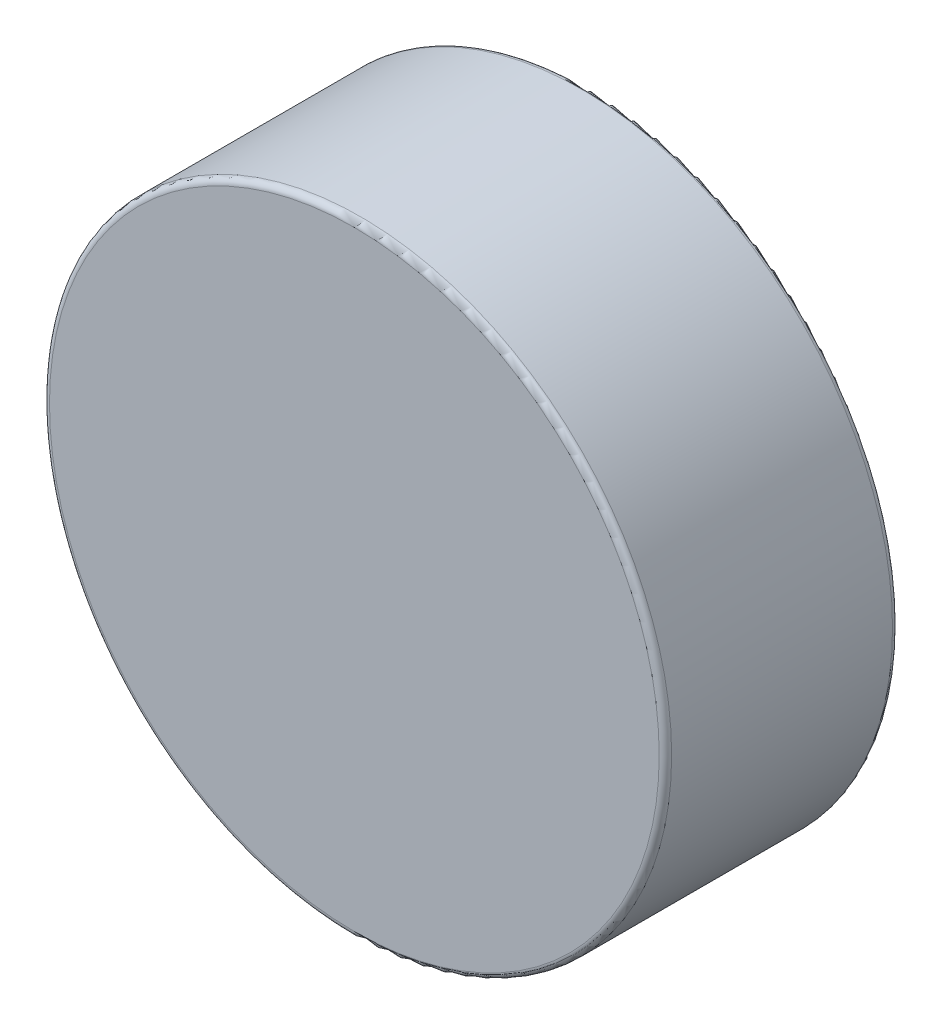
ISO-10303-21;
HEADER;
FILE_DESCRIPTION(('STEP AP214'),'2;1');
FILE_NAME('part.step','',(''),(''),'','','');
FILE_SCHEMA(('AUTOMOTIVE_DESIGN { 1 0 10303 214 1 1 1 1 }'));
ENDSEC;
DATA;
#1=APPLICATION_CONTEXT('core data for automotive mechanical design processes');
#2=APPLICATION_PROTOCOL_DEFINITION('international standard','automotive_design',2000,#1);
#3=PRODUCT_CONTEXT('',#1,'mechanical');
#4=PRODUCT('Part','Part','',(#3));
#5=PRODUCT_RELATED_PRODUCT_CATEGORY('part','',(#4));
#6=PRODUCT_DEFINITION_FORMATION('','',#4);
#7=PRODUCT_DEFINITION_CONTEXT('part definition',#1,'design');
#8=PRODUCT_DEFINITION('design','',#6,#7);
#9=PRODUCT_DEFINITION_SHAPE('','',#8);
#10=(LENGTH_UNIT() NAMED_UNIT(*) SI_UNIT(.MILLI.,.METRE.));
#11=(NAMED_UNIT(*) PLANE_ANGLE_UNIT() SI_UNIT($,.RADIAN.));
#12=(NAMED_UNIT(*) SI_UNIT($,.STERADIAN.) SOLID_ANGLE_UNIT());
#13=UNCERTAINTY_MEASURE_WITH_UNIT(LENGTH_MEASURE(1.E-05),#10,'distance_accuracy_value','');
#14=(GEOMETRIC_REPRESENTATION_CONTEXT(3) GLOBAL_UNCERTAINTY_ASSIGNED_CONTEXT((#13)) GLOBAL_UNIT_ASSIGNED_CONTEXT((#10,
#11,#12)) REPRESENTATION_CONTEXT('',''));
#15=CARTESIAN_POINT('',(0.,0.,0.));
#16=DIRECTION('',(0.,0.,1.));
#17=DIRECTION('',(1.,0.,0.));
#18=AXIS2_PLACEMENT_3D('',#15,#16,#17);
#19=CARTESIAN_POINT('',(0.,0.,2.38125));
#20=DIRECTION('',(0.,0.,-1.));
#21=DIRECTION('',(-1.,0.,0.));
#22=AXIS2_PLACEMENT_3D('',#19,#20,#21);
#23=CYLINDRICAL_SURFACE('',#22,6.35);
#24=CARTESIAN_POINT('',(0.,0.,-2.25425));
#25=DIRECTION('',(0.,0.,1.));
#26=DIRECTION('',(1.,0.,0.));
#27=AXIS2_PLACEMENT_3D('',#24,#25,#26);
#28=CIRCLE('',#27,6.35);
#29=CARTESIAN_POINT('',(6.35,0.,-2.25425));
#30=VERTEX_POINT('',#29);
#31=EDGE_CURVE('E41',#30,#30,#28,.T.);
#32=ORIENTED_EDGE('',*,*,#31,.T.);
#33=EDGE_LOOP('',(#32));
#34=FACE_BOUND('',#33,.T.);
#35=CARTESIAN_POINT('',(0.,0.,2.25425));
#36=DIRECTION('',(0.,0.,1.));
#37=DIRECTION('',(1.,0.,0.));
#38=AXIS2_PLACEMENT_3D('',#35,#36,#37);
#39=CIRCLE('',#38,6.35);
#40=CARTESIAN_POINT('',(6.35,0.,2.25425));
#41=VERTEX_POINT('',#40);
#42=EDGE_CURVE('E45',#41,#41,#39,.F.);
#43=ORIENTED_EDGE('',*,*,#42,.T.);
#44=EDGE_LOOP('',(#43));
#45=FACE_BOUND('',#44,.T.);
#46=ADVANCED_FACE('F30',(#34,#45),#23,.T.);
#47=CARTESIAN_POINT('',(0.,0.,2.38125));
#48=DIRECTION('',(0.,0.,1.));
#49=DIRECTION('',(1.,0.,0.));
#50=AXIS2_PLACEMENT_3D('',#47,#48,#49);
#51=PLANE('',#50);
#52=CARTESIAN_POINT('',(0.,0.,2.38125));
#53=DIRECTION('',(0.,0.,1.));
#54=DIRECTION('',(1.,0.,0.));
#55=AXIS2_PLACEMENT_3D('',#52,#53,#54);
#56=CIRCLE('',#55,6.223);
#57=CARTESIAN_POINT('',(6.223,0.,2.38125));
#58=VERTEX_POINT('',#57);
#59=EDGE_CURVE('E10',#58,#58,#56,.T.);
#60=ORIENTED_EDGE('',*,*,#59,.T.);
#61=EDGE_LOOP('',(#60));
#62=FACE_BOUND('',#61,.T.);
#63=ADVANCED_FACE('F61',(#62),#51,.T.);
#64=CARTESIAN_POINT('',(0.,0.,-2.38125));
#65=DIRECTION('',(0.,0.,1.));
#66=DIRECTION('',(1.,0.,0.));
#67=AXIS2_PLACEMENT_3D('',#64,#65,#66);
#68=PLANE('',#67);
#69=CARTESIAN_POINT('',(0.,0.,-2.38125));
#70=DIRECTION('',(0.,0.,1.));
#71=DIRECTION('',(1.,0.,0.));
#72=AXIS2_PLACEMENT_3D('',#69,#70,#71);
#73=CIRCLE('',#72,6.223);
#74=CARTESIAN_POINT('',(6.223,0.,-2.38125));
#75=VERTEX_POINT('',#74);
#76=EDGE_CURVE('E37',#75,#75,#73,.F.);
#77=ORIENTED_EDGE('',*,*,#76,.T.);
#78=EDGE_LOOP('',(#77));
#79=FACE_BOUND('',#78,.T.);
#80=ADVANCED_FACE('F58',(#79),#68,.F.);
#81=CARTESIAN_POINT('',(0.,0.,-2.25425));
#82=DIRECTION('',(0.,0.,1.));
#83=DIRECTION('',(1.,0.,0.));
#84=AXIS2_PLACEMENT_3D('',#81,#82,#83);
#85=TOROIDAL_SURFACE('',#84,6.223,0.127);
#86=ORIENTED_EDGE('',*,*,#76,.F.);
#87=EDGE_LOOP('',(#86));
#88=FACE_BOUND('',#87,.T.);
#89=ORIENTED_EDGE('',*,*,#31,.F.);
#90=EDGE_LOOP('',(#89));
#91=FACE_BOUND('',#90,.T.);
#92=ADVANCED_FACE('F54',(#88,#91),#85,.T.);
#93=CARTESIAN_POINT('',(0.,0.,2.25425));
#94=DIRECTION('',(0.,0.,1.));
#95=DIRECTION('',(1.,0.,0.));
#96=AXIS2_PLACEMENT_3D('',#93,#94,#95);
#97=TOROIDAL_SURFACE('',#96,6.223,0.127);
#98=ORIENTED_EDGE('',*,*,#42,.F.);
#99=EDGE_LOOP('',(#98));
#100=FACE_BOUND('',#99,.T.);
#101=ORIENTED_EDGE('',*,*,#59,.F.);
#102=EDGE_LOOP('',(#101));
#103=FACE_BOUND('',#102,.T.);
#104=ADVANCED_FACE('F32',(#100,#103),#97,.T.);
#105=CLOSED_SHELL('',(#46,#63,#80,#92,#104));
#106=MANIFOLD_SOLID_BREP('B2',#105);
#107=ADVANCED_BREP_SHAPE_REPRESENTATION('',(#18,#106),#14);
#108=SHAPE_DEFINITION_REPRESENTATION(#9,#107);
ENDSEC;
END-ISO-10303-21;
